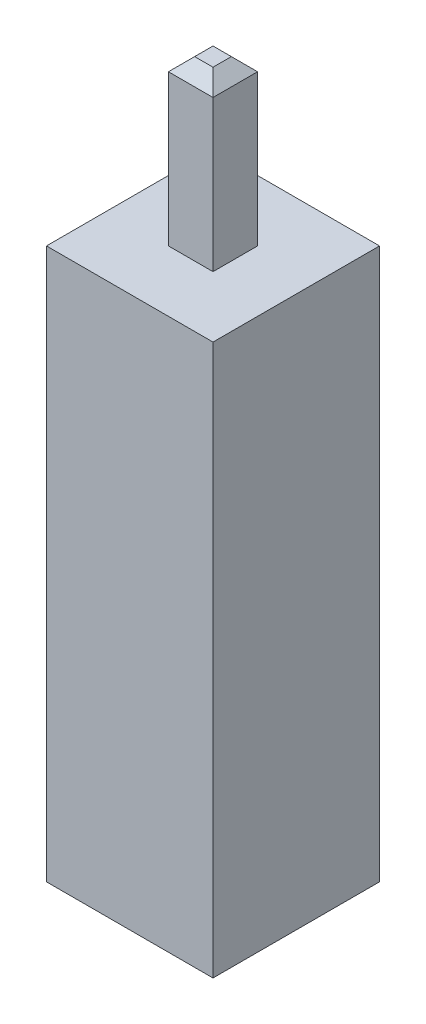
ISO-10303-21;
HEADER;
FILE_DESCRIPTION(('STEP AP214'),'2;1');
FILE_NAME('part.step','',(''),(''),'','','');
FILE_SCHEMA(('AUTOMOTIVE_DESIGN { 1 0 10303 214 1 1 1 1 }'));
ENDSEC;
DATA;
#1=APPLICATION_CONTEXT('core data for automotive mechanical design processes');
#2=APPLICATION_PROTOCOL_DEFINITION('international standard','automotive_design',2000,#1);
#3=PRODUCT_CONTEXT('',#1,'mechanical');
#4=PRODUCT('Part','Part','',(#3));
#5=PRODUCT_RELATED_PRODUCT_CATEGORY('part','',(#4));
#6=PRODUCT_DEFINITION_FORMATION('','',#4);
#7=PRODUCT_DEFINITION_CONTEXT('part definition',#1,'design');
#8=PRODUCT_DEFINITION('design','',#6,#7);
#9=PRODUCT_DEFINITION_SHAPE('','',#8);
#10=(LENGTH_UNIT() NAMED_UNIT(*) SI_UNIT(.MILLI.,.METRE.));
#11=(NAMED_UNIT(*) PLANE_ANGLE_UNIT() SI_UNIT($,.RADIAN.));
#12=(NAMED_UNIT(*) SI_UNIT($,.STERADIAN.) SOLID_ANGLE_UNIT());
#13=UNCERTAINTY_MEASURE_WITH_UNIT(LENGTH_MEASURE(1.E-05),#10,'distance_accuracy_value','');
#14=(GEOMETRIC_REPRESENTATION_CONTEXT(3) GLOBAL_UNCERTAINTY_ASSIGNED_CONTEXT((#13)) GLOBAL_UNIT_ASSIGNED_CONTEXT((#10,
#11,#12)) REPRESENTATION_CONTEXT('',''));
#15=CARTESIAN_POINT('',(0.,0.,0.));
#16=DIRECTION('',(0.,0.,1.));
#17=DIRECTION('',(1.,0.,0.));
#18=AXIS2_PLACEMENT_3D('',#15,#16,#17);
#19=CARTESIAN_POINT('',(-0.5,1.4,0.5));
#20=DIRECTION('',(0.,0.,1.));
#21=DIRECTION('',(1.,0.,0.));
#22=AXIS2_PLACEMENT_3D('',#19,#20,#21);
#23=PLANE('',#22);
#24=DIRECTION('',(0.,1.,0.));
#25=VECTOR('',#24,1.);
#26=CARTESIAN_POINT('',(-0.34,1.4,0.5));
#27=LINE('',#26,#25);
#28=CARTESIAN_POINT('',(-0.34,1.4,0.5));
#29=VERTEX_POINT('',#28);
#30=CARTESIAN_POINT('',(-0.34,7.90063137374777,0.5));
#31=VERTEX_POINT('',#30);
#32=EDGE_CURVE('E291',#29,#31,#27,.T.);
#33=ORIENTED_EDGE('',*,*,#32,.T.);
#34=DIRECTION('',(1.,0.,0.));
#35=VECTOR('',#34,1.);
#36=CARTESIAN_POINT('',(-0.5,7.90063137374777,0.5));
#37=LINE('',#36,#35);
#38=CARTESIAN_POINT('',(0.34,7.90063137374777,0.5));
#39=VERTEX_POINT('',#38);
#40=EDGE_CURVE('E254',#31,#39,#37,.T.);
#41=ORIENTED_EDGE('',*,*,#40,.T.);
#42=DIRECTION('',(0.,1.,0.));
#43=VECTOR('',#42,1.);
#44=CARTESIAN_POINT('',(0.34,1.4,0.5));
#45=LINE('',#44,#43);
#46=CARTESIAN_POINT('',(0.34,1.4,0.5));
#47=VERTEX_POINT('',#46);
#48=EDGE_CURVE('E217',#47,#39,#45,.T.);
#49=ORIENTED_EDGE('',*,*,#48,.F.);
#50=DIRECTION('',(1.,0.,0.));
#51=VECTOR('',#50,1.);
#52=CARTESIAN_POINT('',(-0.5,1.4,0.5));
#53=LINE('',#52,#51);
#54=EDGE_CURVE('E310',#29,#47,#53,.T.);
#55=ORIENTED_EDGE('',*,*,#54,.F.);
#56=EDGE_LOOP('',(#33,#41,#49,#55));
#57=FACE_BOUND('',#56,.T.);
#58=ADVANCED_FACE('F43',(#57),#23,.F.);
#59=CARTESIAN_POINT('',(-0.5,1.4,-0.5));
#60=DIRECTION('',(0.,0.,-1.));
#61=DIRECTION('',(-1.,0.,0.));
#62=AXIS2_PLACEMENT_3D('',#59,#60,#61);
#63=PLANE('',#62);
#64=DIRECTION('',(0.,1.,0.));
#65=VECTOR('',#64,1.);
#66=CARTESIAN_POINT('',(0.34,1.4,-0.5));
#67=LINE('',#66,#65);
#68=CARTESIAN_POINT('',(0.34,1.4,-0.5));
#69=VERTEX_POINT('',#68);
#70=CARTESIAN_POINT('',(0.34,7.90063137374777,-0.5));
#71=VERTEX_POINT('',#70);
#72=EDGE_CURVE('E286',#69,#71,#67,.T.);
#73=ORIENTED_EDGE('',*,*,#72,.T.);
#74=DIRECTION('',(-1.,0.,0.));
#75=VECTOR('',#74,1.);
#76=CARTESIAN_POINT('',(-0.5,7.90063137374777,-0.5));
#77=LINE('',#76,#75);
#78=CARTESIAN_POINT('',(-0.34,7.90063137374777,-0.5));
#79=VERTEX_POINT('',#78);
#80=EDGE_CURVE('E252',#71,#79,#77,.T.);
#81=ORIENTED_EDGE('',*,*,#80,.T.);
#82=DIRECTION('',(0.,1.,0.));
#83=VECTOR('',#82,1.);
#84=CARTESIAN_POINT('',(-0.34,1.4,-0.5));
#85=LINE('',#84,#83);
#86=CARTESIAN_POINT('',(-0.34,1.4,-0.5));
#87=VERTEX_POINT('',#86);
#88=EDGE_CURVE('E295',#87,#79,#85,.T.);
#89=ORIENTED_EDGE('',*,*,#88,.F.);
#90=DIRECTION('',(-1.,0.,0.));
#91=VECTOR('',#90,1.);
#92=CARTESIAN_POINT('',(-0.5,1.4,-0.5));
#93=LINE('',#92,#91);
#94=EDGE_CURVE('E307',#69,#87,#93,.T.);
#95=ORIENTED_EDGE('',*,*,#94,.F.);
#96=EDGE_LOOP('',(#73,#81,#89,#95));
#97=FACE_BOUND('',#96,.T.);
#98=ADVANCED_FACE('F497',(#97),#63,.F.);
#99=CARTESIAN_POINT('',(0.,1.4,0.));
#100=DIRECTION('',(0.,-1.,0.));
#101=DIRECTION('',(0.,0.,-1.));
#102=AXIS2_PLACEMENT_3D('',#99,#100,#101);
#103=PLANE('',#102);
#104=DIRECTION('',(0.,0.,1.));
#105=VECTOR('',#104,1.);
#106=CARTESIAN_POINT('',(0.34,1.4,-0.5));
#107=LINE('',#106,#105);
#108=CARTESIAN_POINT('',(0.34,1.4,-0.340000000000001));
#109=VERTEX_POINT('',#108);
#110=EDGE_CURVE('E223',#69,#109,#107,.T.);
#111=ORIENTED_EDGE('',*,*,#110,.F.);
#112=ORIENTED_EDGE('',*,*,#94,.T.);
#113=DIRECTION('',(0.,0.,1.));
#114=VECTOR('',#113,1.);
#115=CARTESIAN_POINT('',(-0.34,1.4,-0.5));
#116=LINE('',#115,#114);
#117=CARTESIAN_POINT('',(-0.34,1.4,-0.340000000000001));
#118=VERTEX_POINT('',#117);
#119=EDGE_CURVE('E299',#87,#118,#116,.T.);
#120=ORIENTED_EDGE('',*,*,#119,.T.);
#121=DIRECTION('',(1.,0.,0.));
#122=VECTOR('',#121,1.);
#123=CARTESIAN_POINT('',(-0.34,1.4,-0.340000000000001));
#124=LINE('',#123,#122);
#125=EDGE_CURVE('E314',#118,#109,#124,.T.);
#126=ORIENTED_EDGE('',*,*,#125,.T.);
#127=EDGE_LOOP('',(#111,#112,#120,#126));
#128=FACE_BOUND('',#127,.T.);
#129=ADVANCED_FACE('F503',(#128),#103,.F.);
#130=DIRECTION('',(0.,0.,1.));
#131=VECTOR('',#130,1.);
#132=CARTESIAN_POINT('',(0.34,1.4,0.));
#133=LINE('',#132,#131);
#134=CARTESIAN_POINT('',(0.34,1.4,0.339999999999999));
#135=VERTEX_POINT('',#134);
#136=EDGE_CURVE('E421',#135,#47,#133,.T.);
#137=ORIENTED_EDGE('',*,*,#136,.F.);
#138=DIRECTION('',(-1.,0.,0.));
#139=VECTOR('',#138,1.);
#140=CARTESIAN_POINT('',(-0.34,1.4,0.339999999999999));
#141=LINE('',#140,#139);
#142=CARTESIAN_POINT('',(-0.34,1.4,0.339999999999999));
#143=VERTEX_POINT('',#142);
#144=EDGE_CURVE('E375',#135,#143,#141,.T.);
#145=ORIENTED_EDGE('',*,*,#144,.T.);
#146=DIRECTION('',(0.,0.,1.));
#147=VECTOR('',#146,1.);
#148=CARTESIAN_POINT('',(-0.34,1.4,0.));
#149=LINE('',#148,#147);
#150=EDGE_CURVE('E405',#143,#29,#149,.T.);
#151=ORIENTED_EDGE('',*,*,#150,.T.);
#152=ORIENTED_EDGE('',*,*,#54,.T.);
#153=EDGE_LOOP('',(#137,#145,#151,#152));
#154=FACE_BOUND('',#153,.T.);
#155=ADVANCED_FACE('F529',(#154),#103,.F.);
#156=CARTESIAN_POINT('',(0.,8.4,0.));
#157=DIRECTION('',(0.,-1.,0.));
#158=DIRECTION('',(0.,0.,-1.));
#159=AXIS2_PLACEMENT_3D('',#156,#157,#158);
#160=PLANE('',#159);
#161=DIRECTION('',(0.,0.,-1.));
#162=VECTOR('',#161,1.);
#163=CARTESIAN_POINT('',(1.27,8.4,1.27));
#164=LINE('',#163,#162);
#165=CARTESIAN_POINT('',(1.27,8.4,1.27));
#166=VERTEX_POINT('',#165);
#167=CARTESIAN_POINT('',(1.27,8.4,-1.27));
#168=VERTEX_POINT('',#167);
#169=EDGE_CURVE('E334',#166,#168,#164,.T.);
#170=ORIENTED_EDGE('',*,*,#169,.T.);
#171=DIRECTION('',(-1.,0.,0.));
#172=VECTOR('',#171,1.);
#173=CARTESIAN_POINT('',(-1.27,8.4,-1.27));
#174=LINE('',#173,#172);
#175=CARTESIAN_POINT('',(-1.27,8.4,-1.27));
#176=VERTEX_POINT('',#175);
#177=EDGE_CURVE('E338',#168,#176,#174,.T.);
#178=ORIENTED_EDGE('',*,*,#177,.T.);
#179=DIRECTION('',(0.,0.,1.));
#180=VECTOR('',#179,1.);
#181=CARTESIAN_POINT('',(-1.27,8.4,1.27));
#182=LINE('',#181,#180);
#183=CARTESIAN_POINT('',(-1.27,8.4,1.27));
#184=VERTEX_POINT('',#183);
#185=EDGE_CURVE('E342',#176,#184,#182,.T.);
#186=ORIENTED_EDGE('',*,*,#185,.T.);
#187=DIRECTION('',(1.,0.,0.));
#188=VECTOR('',#187,1.);
#189=CARTESIAN_POINT('',(-1.27,8.4,1.27));
#190=LINE('',#189,#188);
#191=EDGE_CURVE('E345',#184,#166,#190,.T.);
#192=ORIENTED_EDGE('',*,*,#191,.T.);
#193=EDGE_LOOP('',(#170,#178,#186,#192));
#194=FACE_BOUND('',#193,.T.);
#195=DIRECTION('',(0.,0.,-1.));
#196=VECTOR('',#195,1.);
#197=CARTESIAN_POINT('',(0.34,8.4,-0.340000000000001));
#198=LINE('',#197,#196);
#199=CARTESIAN_POINT('',(0.34,8.4,0.340000000000001));
#200=VERTEX_POINT('',#199);
#201=CARTESIAN_POINT('',(0.34,8.4,-0.340000000000001));
#202=VERTEX_POINT('',#201);
#203=EDGE_CURVE('E806',#200,#202,#198,.T.);
#204=ORIENTED_EDGE('',*,*,#203,.F.);
#205=DIRECTION('',(1.,0.,0.));
#206=VECTOR('',#205,1.);
#207=CARTESIAN_POINT('',(-0.34,8.4,0.340000000000001));
#208=LINE('',#207,#206);
#209=CARTESIAN_POINT('',(-0.34,8.4,0.340000000000001));
#210=VERTEX_POINT('',#209);
#211=EDGE_CURVE('E810',#210,#200,#208,.T.);
#212=ORIENTED_EDGE('',*,*,#211,.F.);
#213=DIRECTION('',(0.,0.,1.));
#214=VECTOR('',#213,1.);
#215=CARTESIAN_POINT('',(-0.34,8.4,-0.340000000000001));
#216=LINE('',#215,#214);
#217=CARTESIAN_POINT('',(-0.34,8.4,-0.340000000000001));
#218=VERTEX_POINT('',#217);
#219=EDGE_CURVE('E248',#218,#210,#216,.T.);
#220=ORIENTED_EDGE('',*,*,#219,.F.);
#221=DIRECTION('',(-1.,0.,0.));
#222=VECTOR('',#221,1.);
#223=CARTESIAN_POINT('',(-0.34,8.4,-0.340000000000001));
#224=LINE('',#223,#222);
#225=EDGE_CURVE('E241',#202,#218,#224,.T.);
#226=ORIENTED_EDGE('',*,*,#225,.F.);
#227=EDGE_LOOP('',(#204,#212,#220,#226));
#228=FACE_BOUND('',#227,.T.);
#229=ADVANCED_FACE('F525',(#194,#228),#160,.F.);
#230=CARTESIAN_POINT('',(0.,0.,0.));
#231=DIRECTION('',(0.,-1.,0.));
#232=DIRECTION('',(0.,0.,-1.));
#233=AXIS2_PLACEMENT_3D('',#230,#231,#232);
#234=PLANE('',#233);
#235=DIRECTION('',(0.,0.,1.));
#236=VECTOR('',#235,1.);
#237=CARTESIAN_POINT('',(-0.84,0.,0.));
#238=LINE('',#237,#236);
#239=CARTESIAN_POINT('',(-0.84,0.,-0.840000000000001));
#240=VERTEX_POINT('',#239);
#241=CARTESIAN_POINT('',(-0.84,0.,0.839999999999999));
#242=VERTEX_POINT('',#241);
#243=EDGE_CURVE('E385',#240,#242,#238,.T.);
#244=ORIENTED_EDGE('',*,*,#243,.T.);
#245=DIRECTION('',(1.,0.,0.));
#246=VECTOR('',#245,1.);
#247=CARTESIAN_POINT('',(0.,0.,0.839999999999999));
#248=LINE('',#247,#246);
#249=CARTESIAN_POINT('',(0.84,0.,0.839999999999999));
#250=VERTEX_POINT('',#249);
#251=EDGE_CURVE('E388',#242,#250,#248,.T.);
#252=ORIENTED_EDGE('',*,*,#251,.T.);
#253=DIRECTION('',(0.,0.,-1.));
#254=VECTOR('',#253,1.);
#255=CARTESIAN_POINT('',(0.84,0.,0.));
#256=LINE('',#255,#254);
#257=CARTESIAN_POINT('',(0.84,0.,-0.840000000000001));
#258=VERTEX_POINT('',#257);
#259=EDGE_CURVE('E382',#250,#258,#256,.T.);
#260=ORIENTED_EDGE('',*,*,#259,.T.);
#261=DIRECTION('',(-1.,0.,0.));
#262=VECTOR('',#261,1.);
#263=CARTESIAN_POINT('',(0.,0.,-0.840000000000001));
#264=LINE('',#263,#262);
#265=EDGE_CURVE('E379',#258,#240,#264,.T.);
#266=ORIENTED_EDGE('',*,*,#265,.T.);
#267=EDGE_LOOP('',(#244,#252,#260,#266));
#268=FACE_BOUND('',#267,.T.);
#269=DIRECTION('',(0.,0.,-1.));
#270=VECTOR('',#269,1.);
#271=CARTESIAN_POINT('',(1.27,0.,1.27));
#272=LINE('',#271,#270);
#273=CARTESIAN_POINT('',(1.27,0.,1.27));
#274=VERTEX_POINT('',#273);
#275=CARTESIAN_POINT('',(1.27,0.,-1.27));
#276=VERTEX_POINT('',#275);
#277=EDGE_CURVE('E333',#274,#276,#272,.T.);
#278=ORIENTED_EDGE('',*,*,#277,.F.);
#279=DIRECTION('',(1.,0.,0.));
#280=VECTOR('',#279,1.);
#281=CARTESIAN_POINT('',(-1.27,0.,1.27));
#282=LINE('',#281,#280);
#283=CARTESIAN_POINT('',(-1.27,0.,1.27));
#284=VERTEX_POINT('',#283);
#285=EDGE_CURVE('E339',#284,#274,#282,.T.);
#286=ORIENTED_EDGE('',*,*,#285,.F.);
#287=DIRECTION('',(0.,0.,1.));
#288=VECTOR('',#287,1.);
#289=CARTESIAN_POINT('',(-1.27,0.,1.27));
#290=LINE('',#289,#288);
#291=CARTESIAN_POINT('',(-1.27,0.,-1.27));
#292=VERTEX_POINT('',#291);
#293=EDGE_CURVE('E355',#292,#284,#290,.T.);
#294=ORIENTED_EDGE('',*,*,#293,.F.);
#295=DIRECTION('',(-1.,0.,0.));
#296=VECTOR('',#295,1.);
#297=CARTESIAN_POINT('',(-1.27,0.,-1.27));
#298=LINE('',#297,#296);
#299=EDGE_CURVE('E352',#276,#292,#298,.T.);
#300=ORIENTED_EDGE('',*,*,#299,.F.);
#301=EDGE_LOOP('',(#278,#286,#294,#300));
#302=FACE_BOUND('',#301,.T.);
#303=ADVANCED_FACE('F528',(#268,#302),#234,.T.);
#304=CARTESIAN_POINT('',(1.27,8.4,1.27));
#305=DIRECTION('',(-1.,0.,0.));
#306=DIRECTION('',(0.,0.,1.));
#307=AXIS2_PLACEMENT_3D('',#304,#305,#306);
#308=PLANE('',#307);
#309=ORIENTED_EDGE('',*,*,#277,.T.);
#310=DIRECTION('',(0.,-1.,0.));
#311=VECTOR('',#310,1.);
#312=CARTESIAN_POINT('',(1.27,8.4,-1.27));
#313=LINE('',#312,#311);
#314=EDGE_CURVE('E371',#168,#276,#313,.T.);
#315=ORIENTED_EDGE('',*,*,#314,.F.);
#316=ORIENTED_EDGE('',*,*,#169,.F.);
#317=DIRECTION('',(0.,-1.,0.));
#318=VECTOR('',#317,1.);
#319=CARTESIAN_POINT('',(1.27,8.4,1.27));
#320=LINE('',#319,#318);
#321=EDGE_CURVE('E348',#166,#274,#320,.T.);
#322=ORIENTED_EDGE('',*,*,#321,.T.);
#323=EDGE_LOOP('',(#309,#315,#316,#322));
#324=FACE_BOUND('',#323,.T.);
#325=ADVANCED_FACE('F533',(#324),#308,.F.);
#326=CARTESIAN_POINT('',(-1.27,8.4,-1.27));
#327=DIRECTION('',(0.,0.,1.));
#328=DIRECTION('',(1.,0.,0.));
#329=AXIS2_PLACEMENT_3D('',#326,#327,#328);
#330=PLANE('',#329);
#331=ORIENTED_EDGE('',*,*,#299,.T.);
#332=DIRECTION('',(0.,-1.,0.));
#333=VECTOR('',#332,1.);
#334=CARTESIAN_POINT('',(-1.27,8.4,-1.27));
#335=LINE('',#334,#333);
#336=EDGE_CURVE('E367',#176,#292,#335,.T.);
#337=ORIENTED_EDGE('',*,*,#336,.F.);
#338=ORIENTED_EDGE('',*,*,#177,.F.);
#339=ORIENTED_EDGE('',*,*,#314,.T.);
#340=EDGE_LOOP('',(#331,#337,#338,#339));
#341=FACE_BOUND('',#340,.T.);
#342=ADVANCED_FACE('F541',(#341),#330,.F.);
#343=CARTESIAN_POINT('',(-1.27,8.4,1.27));
#344=DIRECTION('',(1.,0.,0.));
#345=DIRECTION('',(0.,0.,-1.));
#346=AXIS2_PLACEMENT_3D('',#343,#344,#345);
#347=PLANE('',#346);
#348=ORIENTED_EDGE('',*,*,#293,.T.);
#349=DIRECTION('',(0.,-1.,0.));
#350=VECTOR('',#349,1.);
#351=CARTESIAN_POINT('',(-1.27,8.4,1.27));
#352=LINE('',#351,#350);
#353=EDGE_CURVE('E363',#184,#284,#352,.T.);
#354=ORIENTED_EDGE('',*,*,#353,.F.);
#355=ORIENTED_EDGE('',*,*,#185,.F.);
#356=ORIENTED_EDGE('',*,*,#336,.T.);
#357=EDGE_LOOP('',(#348,#354,#355,#356));
#358=FACE_BOUND('',#357,.T.);
#359=ADVANCED_FACE('F537',(#358),#347,.F.);
#360=CARTESIAN_POINT('',(-1.27,8.4,1.27));
#361=DIRECTION('',(0.,0.,-1.));
#362=DIRECTION('',(-1.,0.,0.));
#363=AXIS2_PLACEMENT_3D('',#360,#361,#362);
#364=PLANE('',#363);
#365=ORIENTED_EDGE('',*,*,#285,.T.);
#366=ORIENTED_EDGE('',*,*,#321,.F.);
#367=ORIENTED_EDGE('',*,*,#191,.F.);
#368=ORIENTED_EDGE('',*,*,#353,.T.);
#369=EDGE_LOOP('',(#365,#366,#367,#368));
#370=FACE_BOUND('',#369,.T.);
#371=ADVANCED_FACE('F524',(#370),#364,.F.);
#372=CARTESIAN_POINT('',(0.34,8.4,0.339999999999999));
#373=DIRECTION('',(-1.,0.,0.));
#374=DIRECTION('',(0.,0.,1.));
#375=AXIS2_PLACEMENT_3D('',#372,#373,#374);
#376=PLANE('',#375);
#377=DIRECTION('',(0.,1.,0.));
#378=VECTOR('',#377,1.);
#379=CARTESIAN_POINT('',(0.34,6.90063137374777,0.340000000000001));
#380=LINE('',#379,#378);
#381=CARTESIAN_POINT('',(0.34,6.90063137374777,0.340000000000001));
#382=VERTEX_POINT('',#381);
#383=CARTESIAN_POINT('',(0.34,7.90063137374777,0.340000000000001));
#384=VERTEX_POINT('',#383);
#385=EDGE_CURVE('E214',#382,#384,#380,.T.);
#386=ORIENTED_EDGE('',*,*,#385,.F.);
#387=DIRECTION('',(0.,0.,-1.));
#388=VECTOR('',#387,1.);
#389=CARTESIAN_POINT('',(0.34,6.90063137374777,0.340000000000001));
#390=LINE('',#389,#388);
#391=CARTESIAN_POINT('',(0.34,6.90063137374777,-0.340000000000001));
#392=VERTEX_POINT('',#391);
#393=EDGE_CURVE('E246',#382,#392,#390,.T.);
#394=ORIENTED_EDGE('',*,*,#393,.T.);
#395=DIRECTION('',(0.,1.,0.));
#396=VECTOR('',#395,1.);
#397=CARTESIAN_POINT('',(0.34,6.90063137374777,-0.340000000000001));
#398=LINE('',#397,#396);
#399=CARTESIAN_POINT('',(0.34,7.90063137374777,-0.340000000000001));
#400=VERTEX_POINT('',#399);
#401=EDGE_CURVE('E277',#392,#400,#398,.T.);
#402=ORIENTED_EDGE('',*,*,#401,.T.);
#403=DIRECTION('',(0.,0.,1.));
#404=VECTOR('',#403,1.);
#405=CARTESIAN_POINT('',(0.34,7.90063137374777,-0.5));
#406=LINE('',#405,#404);
#407=EDGE_CURVE('E222',#71,#400,#406,.T.);
#408=ORIENTED_EDGE('',*,*,#407,.F.);
#409=ORIENTED_EDGE('',*,*,#72,.F.);
#410=ORIENTED_EDGE('',*,*,#110,.T.);
#411=DIRECTION('',(0.,-1.,0.));
#412=VECTOR('',#411,1.);
#413=CARTESIAN_POINT('',(0.34,8.4,-0.340000000000001));
#414=LINE('',#413,#412);
#415=CARTESIAN_POINT('',(0.34,0.500000000000002,-0.340000000000001));
#416=VERTEX_POINT('',#415);
#417=EDGE_CURVE('E329',#109,#416,#414,.T.);
#418=ORIENTED_EDGE('',*,*,#417,.T.);
#419=DIRECTION('',(0.,0.,1.));
#420=VECTOR('',#419,1.);
#421=CARTESIAN_POINT('',(0.34,0.500000000000002,0.339999999999999));
#422=LINE('',#421,#420);
#423=CARTESIAN_POINT('',(0.34,0.500000000000002,0.339999999999999));
#424=VERTEX_POINT('',#423);
#425=EDGE_CURVE('E399',#416,#424,#422,.T.);
#426=ORIENTED_EDGE('',*,*,#425,.T.);
#427=DIRECTION('',(0.,-1.,0.));
#428=VECTOR('',#427,1.);
#429=CARTESIAN_POINT('',(0.34,8.4,0.339999999999999));
#430=LINE('',#429,#428);
#431=EDGE_CURVE('E317',#135,#424,#430,.T.);
#432=ORIENTED_EDGE('',*,*,#431,.F.);
#433=ORIENTED_EDGE('',*,*,#136,.T.);
#434=ORIENTED_EDGE('',*,*,#48,.T.);
#435=EDGE_CURVE('E210',#384,#39,#406,.T.);
#436=ORIENTED_EDGE('',*,*,#435,.F.);
#437=EDGE_LOOP('',(#386,#394,#402,#408,#409,#410,#418,#426,#432,#433,#434,#436));
#438=FACE_BOUND('',#437,.T.);
#439=ADVANCED_FACE('F212',(#438),#376,.T.);
#440=CARTESIAN_POINT('',(-0.34,8.4,-0.340000000000001));
#441=DIRECTION('',(0.,0.,1.));
#442=DIRECTION('',(1.,0.,0.));
#443=AXIS2_PLACEMENT_3D('',#440,#441,#442);
#444=PLANE('',#443);
#445=DIRECTION('',(0.,-1.,0.));
#446=VECTOR('',#445,1.);
#447=CARTESIAN_POINT('',(-0.34,8.4,-0.340000000000001));
#448=LINE('',#447,#446);
#449=CARTESIAN_POINT('',(-0.34,0.500000000000002,-0.340000000000001));
#450=VERTEX_POINT('',#449);
#451=EDGE_CURVE('E325',#118,#450,#448,.T.);
#452=ORIENTED_EDGE('',*,*,#451,.T.);
#453=DIRECTION('',(1.,0.,0.));
#454=VECTOR('',#453,1.);
#455=CARTESIAN_POINT('',(-0.34,0.500000000000002,-0.340000000000001));
#456=LINE('',#455,#454);
#457=EDGE_CURVE('E402',#450,#416,#456,.T.);
#458=ORIENTED_EDGE('',*,*,#457,.T.);
#459=ORIENTED_EDGE('',*,*,#417,.F.);
#460=ORIENTED_EDGE('',*,*,#125,.F.);
#461=EDGE_LOOP('',(#452,#458,#459,#460));
#462=FACE_BOUND('',#461,.T.);
#463=ADVANCED_FACE('F517',(#462),#444,.T.);
#464=CARTESIAN_POINT('',(-0.34,8.4,0.339999999999999));
#465=DIRECTION('',(1.,0.,0.));
#466=DIRECTION('',(0.,0.,-1.));
#467=AXIS2_PLACEMENT_3D('',#464,#465,#466);
#468=PLANE('',#467);
#469=DIRECTION('',(0.,1.,0.));
#470=VECTOR('',#469,1.);
#471=CARTESIAN_POINT('',(-0.34,6.90063137374777,0.340000000000001));
#472=LINE('',#471,#470);
#473=CARTESIAN_POINT('',(-0.34,6.90063137374777,0.340000000000001));
#474=VERTEX_POINT('',#473);
#475=CARTESIAN_POINT('',(-0.34,7.90063137374777,0.340000000000001));
#476=VERTEX_POINT('',#475);
#477=EDGE_CURVE('E269',#474,#476,#472,.T.);
#478=ORIENTED_EDGE('',*,*,#477,.T.);
#479=DIRECTION('',(0.,0.,1.));
#480=VECTOR('',#479,1.);
#481=CARTESIAN_POINT('',(-0.34,7.90063137374777,-0.5));
#482=LINE('',#481,#480);
#483=EDGE_CURVE('E238',#476,#31,#482,.T.);
#484=ORIENTED_EDGE('',*,*,#483,.T.);
#485=ORIENTED_EDGE('',*,*,#32,.F.);
#486=ORIENTED_EDGE('',*,*,#150,.F.);
#487=DIRECTION('',(0.,-1.,0.));
#488=VECTOR('',#487,1.);
#489=CARTESIAN_POINT('',(-0.34,8.4,0.339999999999999));
#490=LINE('',#489,#488);
#491=CARTESIAN_POINT('',(-0.34,0.500000000000002,0.339999999999999));
#492=VERTEX_POINT('',#491);
#493=EDGE_CURVE('E321',#143,#492,#490,.T.);
#494=ORIENTED_EDGE('',*,*,#493,.T.);
#495=DIRECTION('',(0.,0.,-1.));
#496=VECTOR('',#495,1.);
#497=CARTESIAN_POINT('',(-0.34,0.500000000000002,0.339999999999999));
#498=LINE('',#497,#496);
#499=EDGE_CURVE('E396',#492,#450,#498,.T.);
#500=ORIENTED_EDGE('',*,*,#499,.T.);
#501=ORIENTED_EDGE('',*,*,#451,.F.);
#502=ORIENTED_EDGE('',*,*,#119,.F.);
#503=ORIENTED_EDGE('',*,*,#88,.T.);
#504=CARTESIAN_POINT('',(-0.34,7.90063137374777,-0.340000000000001));
#505=VERTEX_POINT('',#504);
#506=EDGE_CURVE('E302',#79,#505,#482,.T.);
#507=ORIENTED_EDGE('',*,*,#506,.T.);
#508=DIRECTION('',(0.,1.,0.));
#509=VECTOR('',#508,1.);
#510=CARTESIAN_POINT('',(-0.34,6.90063137374777,-0.340000000000001));
#511=LINE('',#510,#509);
#512=CARTESIAN_POINT('',(-0.34,6.90063137374777,-0.340000000000001));
#513=VERTEX_POINT('',#512);
#514=EDGE_CURVE('E273',#513,#505,#511,.T.);
#515=ORIENTED_EDGE('',*,*,#514,.F.);
#516=DIRECTION('',(0.,0.,1.));
#517=VECTOR('',#516,1.);
#518=CARTESIAN_POINT('',(-0.34,6.90063137374777,0.340000000000001));
#519=LINE('',#518,#517);
#520=EDGE_CURVE('E263',#513,#474,#519,.T.);
#521=ORIENTED_EDGE('',*,*,#520,.T.);
#522=EDGE_LOOP('',(#478,#484,#485,#486,#494,#500,#501,#502,#503,#507,#515,#521));
#523=FACE_BOUND('',#522,.T.);
#524=ADVANCED_FACE('F513',(#523),#468,.T.);
#525=CARTESIAN_POINT('',(-0.34,8.4,0.339999999999999));
#526=DIRECTION('',(0.,0.,-1.));
#527=DIRECTION('',(-1.,0.,0.));
#528=AXIS2_PLACEMENT_3D('',#525,#526,#527);
#529=PLANE('',#528);
#530=ORIENTED_EDGE('',*,*,#431,.T.);
#531=DIRECTION('',(-1.,0.,0.));
#532=VECTOR('',#531,1.);
#533=CARTESIAN_POINT('',(-0.34,0.500000000000002,0.339999999999999));
#534=LINE('',#533,#532);
#535=EDGE_CURVE('E392',#424,#492,#534,.T.);
#536=ORIENTED_EDGE('',*,*,#535,.T.);
#537=ORIENTED_EDGE('',*,*,#493,.F.);
#538=ORIENTED_EDGE('',*,*,#144,.F.);
#539=EDGE_LOOP('',(#530,#536,#537,#538));
#540=FACE_BOUND('',#539,.T.);
#541=ADVANCED_FACE('F509',(#540),#529,.T.);
#542=CARTESIAN_POINT('',(0.,0.,-0.840000000000001));
#543=DIRECTION('',(0.,0.707106781186546,-0.707106781186549));
#544=DIRECTION('',(-1.,0.,0.));
#545=AXIS2_PLACEMENT_3D('',#542,#543,#544);
#546=PLANE('',#545);
#547=DIRECTION('',(-0.577350269189625,0.577350269189628,0.577350269189625));
#548=VECTOR('',#547,1.);
#549=CARTESIAN_POINT('',(0.56,0.280000000000001,-0.560000000000001));
#550=LINE('',#549,#548);
#551=EDGE_CURVE('E411',#416,#258,#550,.F.);
#552=ORIENTED_EDGE('',*,*,#551,.F.);
#553=ORIENTED_EDGE('',*,*,#457,.F.);
#554=DIRECTION('',(-0.577350269189625,-0.577350269189628,-0.577350269189625));
#555=VECTOR('',#554,1.);
#556=CARTESIAN_POINT('',(-0.56,0.280000000000001,-0.560000000000001));
#557=LINE('',#556,#555);
#558=EDGE_CURVE('E311',#240,#450,#557,.F.);
#559=ORIENTED_EDGE('',*,*,#558,.F.);
#560=ORIENTED_EDGE('',*,*,#265,.F.);
#561=EDGE_LOOP('',(#552,#553,#559,#560));
#562=FACE_BOUND('',#561,.T.);
#563=ADVANCED_FACE('F512',(#562),#546,.F.);
#564=CARTESIAN_POINT('',(-0.84,0.,0.));
#565=DIRECTION('',(-0.707106781186549,0.707106781186546,0.));
#566=DIRECTION('',(0.,0.,1.));
#567=AXIS2_PLACEMENT_3D('',#564,#565,#566);
#568=PLANE('',#567);
#569=ORIENTED_EDGE('',*,*,#558,.T.);
#570=ORIENTED_EDGE('',*,*,#499,.F.);
#571=DIRECTION('',(-0.577350269189625,-0.577350269189628,0.577350269189625));
#572=VECTOR('',#571,1.);
#573=CARTESIAN_POINT('',(-0.560000000000001,0.28,0.56));
#574=LINE('',#573,#572);
#575=EDGE_CURVE('E408',#242,#492,#574,.F.);
#576=ORIENTED_EDGE('',*,*,#575,.F.);
#577=ORIENTED_EDGE('',*,*,#243,.F.);
#578=EDGE_LOOP('',(#569,#570,#576,#577));
#579=FACE_BOUND('',#578,.T.);
#580=ADVANCED_FACE('F563',(#579),#568,.F.);
#581=CARTESIAN_POINT('',(0.84,0.,0.));
#582=DIRECTION('',(0.707106781186549,0.707106781186546,0.));
#583=DIRECTION('',(0.,0.,-1.));
#584=AXIS2_PLACEMENT_3D('',#581,#582,#583);
#585=PLANE('',#584);
#586=ORIENTED_EDGE('',*,*,#551,.T.);
#587=ORIENTED_EDGE('',*,*,#259,.F.);
#588=DIRECTION('',(-0.577350269189625,0.577350269189628,-0.577350269189625));
#589=VECTOR('',#588,1.);
#590=CARTESIAN_POINT('',(0.560000000000001,0.28,0.56));
#591=LINE('',#590,#589);
#592=EDGE_CURVE('E306',#424,#250,#591,.F.);
#593=ORIENTED_EDGE('',*,*,#592,.F.);
#594=ORIENTED_EDGE('',*,*,#425,.F.);
#595=EDGE_LOOP('',(#586,#587,#593,#594));
#596=FACE_BOUND('',#595,.T.);
#597=ADVANCED_FACE('F556',(#596),#585,.F.);
#598=CARTESIAN_POINT('',(0.,0.,0.839999999999999));
#599=DIRECTION('',(0.,0.707106781186546,0.707106781186549));
#600=DIRECTION('',(1.,0.,0.));
#601=AXIS2_PLACEMENT_3D('',#598,#599,#600);
#602=PLANE('',#601);
#603=ORIENTED_EDGE('',*,*,#575,.T.);
#604=ORIENTED_EDGE('',*,*,#535,.F.);
#605=ORIENTED_EDGE('',*,*,#592,.T.);
#606=ORIENTED_EDGE('',*,*,#251,.F.);
#607=EDGE_LOOP('',(#603,#604,#605,#606));
#608=FACE_BOUND('',#607,.T.);
#609=ADVANCED_FACE('F550',(#608),#602,.F.);
#610=CARTESIAN_POINT('',(-0.34,6.90063137374777,0.340000000000001));
#611=DIRECTION('',(0.,0.,1.));
#612=DIRECTION('',(1.,0.,0.));
#613=AXIS2_PLACEMENT_3D('',#610,#611,#612);
#614=PLANE('',#613);
#615=DIRECTION('',(1.,0.,0.));
#616=VECTOR('',#615,1.);
#617=CARTESIAN_POINT('',(-0.34,7.90063137374777,0.340000000000001));
#618=LINE('',#617,#616);
#619=EDGE_CURVE('E229',#476,#384,#618,.T.);
#620=ORIENTED_EDGE('',*,*,#619,.F.);
#621=ORIENTED_EDGE('',*,*,#477,.F.);
#622=DIRECTION('',(1.,0.,0.));
#623=VECTOR('',#622,1.);
#624=CARTESIAN_POINT('',(-0.34,6.90063137374777,0.340000000000001));
#625=LINE('',#624,#623);
#626=EDGE_CURVE('E232',#474,#382,#625,.T.);
#627=ORIENTED_EDGE('',*,*,#626,.T.);
#628=ORIENTED_EDGE('',*,*,#385,.T.);
#629=EDGE_LOOP('',(#620,#621,#627,#628));
#630=FACE_BOUND('',#629,.T.);
#631=ADVANCED_FACE('F227',(#630),#614,.T.);
#632=CARTESIAN_POINT('',(-0.34,6.90063137374777,-0.340000000000001));
#633=DIRECTION('',(0.,0.,-1.));
#634=DIRECTION('',(-1.,0.,0.));
#635=AXIS2_PLACEMENT_3D('',#632,#633,#634);
#636=PLANE('',#635);
#637=DIRECTION('',(-1.,0.,0.));
#638=VECTOR('',#637,1.);
#639=CARTESIAN_POINT('',(-0.34,7.90063137374777,-0.340000000000001));
#640=LINE('',#639,#638);
#641=EDGE_CURVE('E240',#400,#505,#640,.T.);
#642=ORIENTED_EDGE('',*,*,#641,.F.);
#643=ORIENTED_EDGE('',*,*,#401,.F.);
#644=DIRECTION('',(-1.,0.,0.));
#645=VECTOR('',#644,1.);
#646=CARTESIAN_POINT('',(-0.34,6.90063137374777,-0.340000000000001));
#647=LINE('',#646,#645);
#648=EDGE_CURVE('E259',#392,#513,#647,.T.);
#649=ORIENTED_EDGE('',*,*,#648,.T.);
#650=ORIENTED_EDGE('',*,*,#514,.T.);
#651=EDGE_LOOP('',(#642,#643,#649,#650));
#652=FACE_BOUND('',#651,.T.);
#653=ADVANCED_FACE('F604',(#652),#636,.T.);
#654=CARTESIAN_POINT('',(0.,6.90063137374777,0.));
#655=DIRECTION('',(0.,-1.,0.));
#656=DIRECTION('',(0.,0.,-1.));
#657=AXIS2_PLACEMENT_3D('',#654,#655,#656);
#658=PLANE('',#657);
#659=ORIENTED_EDGE('',*,*,#393,.F.);
#660=ORIENTED_EDGE('',*,*,#626,.F.);
#661=ORIENTED_EDGE('',*,*,#520,.F.);
#662=ORIENTED_EDGE('',*,*,#648,.F.);
#663=EDGE_LOOP('',(#659,#660,#661,#662));
#664=FACE_BOUND('',#663,.T.);
#665=ADVANCED_FACE('F492',(#664),#658,.T.);
#666=CARTESIAN_POINT('',(0.34,7.90063137374777,-0.5));
#667=DIRECTION('',(0.,-1.,0.));
#668=DIRECTION('',(0.,0.,-1.));
#669=AXIS2_PLACEMENT_3D('',#666,#667,#668);
#670=PLANE('',#669);
#671=ORIENTED_EDGE('',*,*,#80,.F.);
#672=ORIENTED_EDGE('',*,*,#407,.T.);
#673=ORIENTED_EDGE('',*,*,#641,.T.);
#674=ORIENTED_EDGE('',*,*,#506,.F.);
#675=EDGE_LOOP('',(#671,#672,#673,#674));
#676=FACE_BOUND('',#675,.T.);
#677=ADVANCED_FACE('F485',(#676),#670,.T.);
#678=CARTESIAN_POINT('',(0.,10.9006313737478,0.));
#679=DIRECTION('',(0.,-1.,0.));
#680=DIRECTION('',(0.,0.,-1.));
#681=AXIS2_PLACEMENT_3D('',#678,#679,#680);
#682=PLANE('',#681);
#683=DIRECTION('',(0.,0.,-1.));
#684=VECTOR('',#683,1.);
#685=CARTESIAN_POINT('',(0.139999999999998,10.9006313737478,-0.340000000000001));
#686=LINE('',#685,#684);
#687=CARTESIAN_POINT('',(0.139999999999998,10.9006313737478,0.139999999999999));
#688=VERTEX_POINT('',#687);
#689=CARTESIAN_POINT('',(0.139999999999998,10.9006313737478,-0.139999999999999));
#690=VERTEX_POINT('',#689);
#691=EDGE_CURVE('E430',#688,#690,#686,.T.);
#692=ORIENTED_EDGE('',*,*,#691,.T.);
#693=DIRECTION('',(-1.,0.,0.));
#694=VECTOR('',#693,1.);
#695=CARTESIAN_POINT('',(-0.34,10.9006313737478,-0.139999999999999));
#696=LINE('',#695,#694);
#697=CARTESIAN_POINT('',(-0.139999999999998,10.9006313737478,-0.139999999999999));
#698=VERTEX_POINT('',#697);
#699=EDGE_CURVE('E433',#690,#698,#696,.T.);
#700=ORIENTED_EDGE('',*,*,#699,.T.);
#701=DIRECTION('',(0.,0.,1.));
#702=VECTOR('',#701,1.);
#703=CARTESIAN_POINT('',(-0.139999999999998,10.9006313737478,0.340000000000001));
#704=LINE('',#703,#702);
#705=CARTESIAN_POINT('',(-0.139999999999998,10.9006313737478,0.139999999999999));
#706=VERTEX_POINT('',#705);
#707=EDGE_CURVE('E427',#698,#706,#704,.T.);
#708=ORIENTED_EDGE('',*,*,#707,.T.);
#709=DIRECTION('',(1.,0.,0.));
#710=VECTOR('',#709,1.);
#711=CARTESIAN_POINT('',(0.34,10.9006313737478,0.139999999999999));
#712=LINE('',#711,#710);
#713=EDGE_CURVE('E424',#706,#688,#712,.T.);
#714=ORIENTED_EDGE('',*,*,#713,.T.);
#715=EDGE_LOOP('',(#692,#700,#708,#714));
#716=FACE_BOUND('',#715,.T.);
#717=ADVANCED_FACE('F482',(#716),#682,.F.);
#718=CARTESIAN_POINT('',(0.34,10.7006313737478,0.340000000000001));
#719=VERTEX_POINT('',#718);
#720=EDGE_CURVE('E234',#200,#719,#380,.T.);
#721=ORIENTED_EDGE('',*,*,#720,.T.);
#722=DIRECTION('',(-1.,0.,0.));
#723=VECTOR('',#722,1.);
#724=CARTESIAN_POINT('',(-0.34,10.7006313737478,0.340000000000001));
#725=LINE('',#724,#723);
#726=CARTESIAN_POINT('',(-0.34,10.7006313737478,0.340000000000001));
#727=VERTEX_POINT('',#726);
#728=EDGE_CURVE('E11',#719,#727,#725,.T.);
#729=ORIENTED_EDGE('',*,*,#728,.T.);
#730=EDGE_CURVE('E272',#210,#727,#472,.T.);
#731=ORIENTED_EDGE('',*,*,#730,.F.);
#732=ORIENTED_EDGE('',*,*,#211,.T.);
#733=EDGE_LOOP('',(#721,#729,#731,#732));
#734=FACE_BOUND('',#733,.T.);
#735=ADVANCED_FACE('F484',(#734),#614,.T.);
#736=CARTESIAN_POINT('',(-0.34,10.7006313737478,-0.340000000000001));
#737=VERTEX_POINT('',#736);
#738=EDGE_CURVE('E276',#218,#737,#511,.T.);
#739=ORIENTED_EDGE('',*,*,#738,.T.);
#740=DIRECTION('',(1.,0.,0.));
#741=VECTOR('',#740,1.);
#742=CARTESIAN_POINT('',(0.34,10.7006313737478,-0.340000000000001));
#743=LINE('',#742,#741);
#744=CARTESIAN_POINT('',(0.34,10.7006313737478,-0.340000000000001));
#745=VERTEX_POINT('',#744);
#746=EDGE_CURVE('E437',#737,#745,#743,.T.);
#747=ORIENTED_EDGE('',*,*,#746,.T.);
#748=EDGE_CURVE('E267',#202,#745,#398,.T.);
#749=ORIENTED_EDGE('',*,*,#748,.F.);
#750=ORIENTED_EDGE('',*,*,#225,.T.);
#751=EDGE_LOOP('',(#739,#747,#749,#750));
#752=FACE_BOUND('',#751,.T.);
#753=ADVANCED_FACE('F475',(#752),#636,.T.);
#754=CARTESIAN_POINT('',(0.34,6.90063137374777,0.340000000000001));
#755=DIRECTION('',(1.,0.,0.));
#756=DIRECTION('',(0.,0.,-1.));
#757=AXIS2_PLACEMENT_3D('',#754,#755,#756);
#758=PLANE('',#757);
#759=ORIENTED_EDGE('',*,*,#748,.T.);
#760=DIRECTION('',(0.,0.,1.));
#761=VECTOR('',#760,1.);
#762=CARTESIAN_POINT('',(0.34,10.7006313737478,0.340000000000001));
#763=LINE('',#762,#761);
#764=EDGE_CURVE('E68',#745,#719,#763,.T.);
#765=ORIENTED_EDGE('',*,*,#764,.T.);
#766=ORIENTED_EDGE('',*,*,#720,.F.);
#767=ORIENTED_EDGE('',*,*,#203,.T.);
#768=EDGE_LOOP('',(#759,#765,#766,#767));
#769=FACE_BOUND('',#768,.T.);
#770=ADVANCED_FACE('F598',(#769),#758,.T.);
#771=CARTESIAN_POINT('',(-0.34,6.90063137374777,0.340000000000001));
#772=DIRECTION('',(-1.,0.,0.));
#773=DIRECTION('',(0.,0.,1.));
#774=AXIS2_PLACEMENT_3D('',#771,#772,#773);
#775=PLANE('',#774);
#776=ORIENTED_EDGE('',*,*,#730,.T.);
#777=DIRECTION('',(0.,0.,-1.));
#778=VECTOR('',#777,1.);
#779=CARTESIAN_POINT('',(-0.34,10.7006313737478,-0.340000000000001));
#780=LINE('',#779,#778);
#781=EDGE_CURVE('E54',#727,#737,#780,.T.);
#782=ORIENTED_EDGE('',*,*,#781,.T.);
#783=ORIENTED_EDGE('',*,*,#738,.F.);
#784=ORIENTED_EDGE('',*,*,#219,.T.);
#785=EDGE_LOOP('',(#776,#782,#783,#784));
#786=FACE_BOUND('',#785,.T.);
#787=ADVANCED_FACE('F471',(#786),#775,.T.);
#788=ORIENTED_EDGE('',*,*,#619,.T.);
#789=ORIENTED_EDGE('',*,*,#435,.T.);
#790=ORIENTED_EDGE('',*,*,#40,.F.);
#791=ORIENTED_EDGE('',*,*,#483,.F.);
#792=EDGE_LOOP('',(#788,#789,#790,#791));
#793=FACE_BOUND('',#792,.T.);
#794=ADVANCED_FACE('F237',(#793),#670,.T.);
#795=CARTESIAN_POINT('',(0.,10.9006313737478,0.139999999999999));
#796=DIRECTION('',(0.,0.707106781186547,0.707106781186547));
#797=DIRECTION('',(-1.,0.,0.));
#798=AXIS2_PLACEMENT_3D('',#795,#796,#797);
#799=PLANE('',#798);
#800=DIRECTION('',(-0.577350269189626,-0.577350269189626,0.577350269189626));
#801=VECTOR('',#800,1.);
#802=CARTESIAN_POINT('',(-0.0933333333333318,10.9472980404144,0.0933333333333327));
#803=LINE('',#802,#801);
#804=EDGE_CURVE('E450',#727,#706,#803,.F.);
#805=ORIENTED_EDGE('',*,*,#804,.F.);
#806=ORIENTED_EDGE('',*,*,#728,.F.);
#807=DIRECTION('',(-0.577350269189626,0.577350269189626,-0.577350269189626));
#808=VECTOR('',#807,1.);
#809=CARTESIAN_POINT('',(0.0933333333333318,10.9472980404144,0.0933333333333327));
#810=LINE('',#809,#808);
#811=EDGE_CURVE('E48',#688,#719,#810,.F.);
#812=ORIENTED_EDGE('',*,*,#811,.F.);
#813=ORIENTED_EDGE('',*,*,#713,.F.);
#814=EDGE_LOOP('',(#805,#806,#812,#813));
#815=FACE_BOUND('',#814,.T.);
#816=ADVANCED_FACE('F46',(#815),#799,.T.);
#817=CARTESIAN_POINT('',(0.139999999999998,10.9006313737478,0.));
#818=DIRECTION('',(0.707106781186547,0.707106781186547,0.));
#819=DIRECTION('',(0.,0.,1.));
#820=AXIS2_PLACEMENT_3D('',#817,#818,#819);
#821=PLANE('',#820);
#822=ORIENTED_EDGE('',*,*,#811,.T.);
#823=ORIENTED_EDGE('',*,*,#764,.F.);
#824=DIRECTION('',(-0.577350269189626,0.577350269189626,0.577350269189626));
#825=VECTOR('',#824,1.);
#826=CARTESIAN_POINT('',(0.0933333333333315,10.9472980404144,-0.0933333333333324));
#827=LINE('',#826,#825);
#828=EDGE_CURVE('E448',#690,#745,#827,.F.);
#829=ORIENTED_EDGE('',*,*,#828,.F.);
#830=ORIENTED_EDGE('',*,*,#691,.F.);
#831=EDGE_LOOP('',(#822,#823,#829,#830));
#832=FACE_BOUND('',#831,.T.);
#833=ADVANCED_FACE('F462',(#832),#821,.T.);
#834=CARTESIAN_POINT('',(-0.139999999999998,10.9006313737478,0.));
#835=DIRECTION('',(-0.707106781186547,0.707106781186547,0.));
#836=DIRECTION('',(0.,0.,-1.));
#837=AXIS2_PLACEMENT_3D('',#834,#835,#836);
#838=PLANE('',#837);
#839=ORIENTED_EDGE('',*,*,#804,.T.);
#840=ORIENTED_EDGE('',*,*,#707,.F.);
#841=DIRECTION('',(-0.577350269189626,-0.577350269189626,-0.577350269189626));
#842=VECTOR('',#841,1.);
#843=CARTESIAN_POINT('',(-0.0933333333333315,10.9472980404144,-0.0933333333333324));
#844=LINE('',#843,#842);
#845=EDGE_CURVE('E445',#737,#698,#844,.F.);
#846=ORIENTED_EDGE('',*,*,#845,.F.);
#847=ORIENTED_EDGE('',*,*,#781,.F.);
#848=EDGE_LOOP('',(#839,#840,#846,#847));
#849=FACE_BOUND('',#848,.T.);
#850=ADVANCED_FACE('F467',(#849),#838,.T.);
#851=CARTESIAN_POINT('',(0.,10.9006313737478,-0.139999999999999));
#852=DIRECTION('',(0.,0.707106781186547,-0.707106781186547));
#853=DIRECTION('',(1.,0.,0.));
#854=AXIS2_PLACEMENT_3D('',#851,#852,#853);
#855=PLANE('',#854);
#856=ORIENTED_EDGE('',*,*,#828,.T.);
#857=ORIENTED_EDGE('',*,*,#746,.F.);
#858=ORIENTED_EDGE('',*,*,#845,.T.);
#859=ORIENTED_EDGE('',*,*,#699,.F.);
#860=EDGE_LOOP('',(#856,#857,#858,#859));
#861=FACE_BOUND('',#860,.T.);
#862=ADVANCED_FACE('F479',(#861),#855,.T.);
#863=CLOSED_SHELL('',(#58,#98,#129,#155,#229,#303,#325,#342,#359,#371,#439,#463,#524,#541,#563,
#580,#597,#609,#631,#653,#665,#677,#717,#735,#753,#770,#787,#794,#816,#833,#850,#862));
#864=MANIFOLD_SOLID_BREP('B2',#863);
#865=ADVANCED_BREP_SHAPE_REPRESENTATION('',(#18,#864),#14);
#866=SHAPE_DEFINITION_REPRESENTATION(#9,#865);
ENDSEC;
END-ISO-10303-21;
